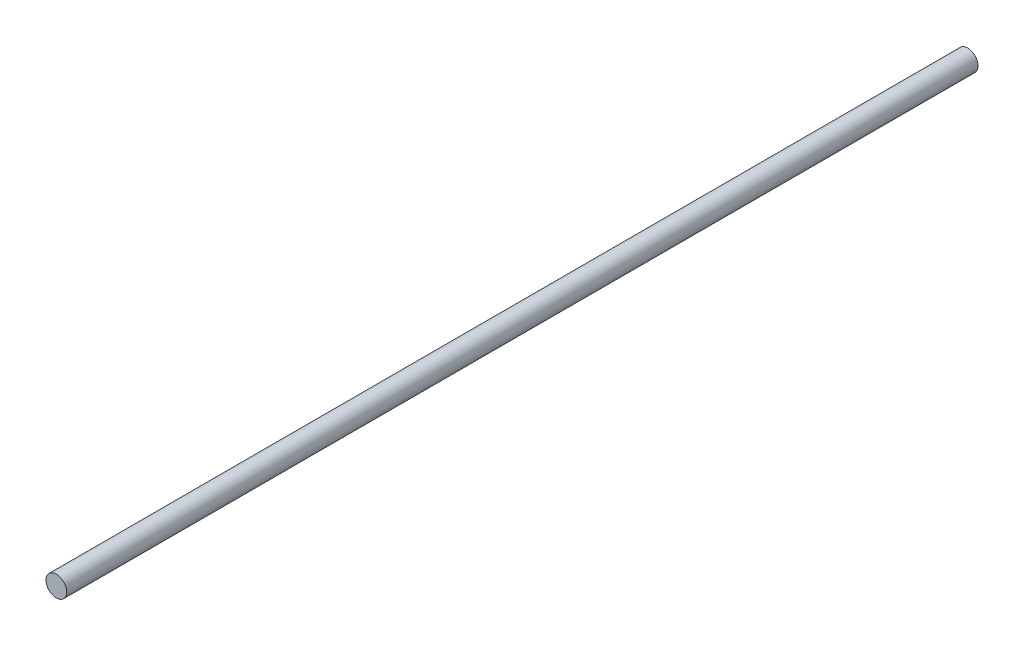
ISO-10303-21;
HEADER;
FILE_DESCRIPTION(('STEP AP214'),'2;1');
FILE_NAME('part.step','',(''),(''),'','','');
FILE_SCHEMA(('AUTOMOTIVE_DESIGN { 1 0 10303 214 1 1 1 1 }'));
ENDSEC;
DATA;
#1=APPLICATION_CONTEXT('core data for automotive mechanical design processes');
#2=APPLICATION_PROTOCOL_DEFINITION('international standard','automotive_design',2000,#1);
#3=PRODUCT_CONTEXT('',#1,'mechanical');
#4=PRODUCT('Part','Part','',(#3));
#5=PRODUCT_RELATED_PRODUCT_CATEGORY('part','',(#4));
#6=PRODUCT_DEFINITION_FORMATION('','',#4);
#7=PRODUCT_DEFINITION_CONTEXT('part definition',#1,'design');
#8=PRODUCT_DEFINITION('design','',#6,#7);
#9=PRODUCT_DEFINITION_SHAPE('','',#8);
#10=(LENGTH_UNIT() NAMED_UNIT(*) SI_UNIT(.MILLI.,.METRE.));
#11=(NAMED_UNIT(*) PLANE_ANGLE_UNIT() SI_UNIT($,.RADIAN.));
#12=(NAMED_UNIT(*) SI_UNIT($,.STERADIAN.) SOLID_ANGLE_UNIT());
#13=UNCERTAINTY_MEASURE_WITH_UNIT(LENGTH_MEASURE(1.E-05),#10,'distance_accuracy_value','');
#14=(GEOMETRIC_REPRESENTATION_CONTEXT(3) GLOBAL_UNCERTAINTY_ASSIGNED_CONTEXT((#13)) GLOBAL_UNIT_ASSIGNED_CONTEXT((#10,
#11,#12)) REPRESENTATION_CONTEXT('',''));
#15=CARTESIAN_POINT('',(0.,0.,0.));
#16=DIRECTION('',(0.,0.,1.));
#17=DIRECTION('',(1.,0.,0.));
#18=AXIS2_PLACEMENT_3D('',#15,#16,#17);
#19=CARTESIAN_POINT('',(0.,0.,280.035));
#20=DIRECTION('',(0.,0.,-1.));
#21=DIRECTION('',(-1.,0.,0.));
#22=AXIS2_PLACEMENT_3D('',#19,#20,#21);
#23=CYLINDRICAL_SURFACE('',#22,3.175);
#24=CARTESIAN_POINT('',(0.,0.,280.035));
#25=DIRECTION('',(0.,0.,1.));
#26=DIRECTION('',(1.,0.,0.));
#27=AXIS2_PLACEMENT_3D('',#24,#25,#26);
#28=CIRCLE('',#27,3.175);
#29=CARTESIAN_POINT('',(3.175,0.,280.035));
#30=VERTEX_POINT('',#29);
#31=EDGE_CURVE('E10',#30,#30,#28,.T.);
#32=ORIENTED_EDGE('',*,*,#31,.F.);
#33=EDGE_LOOP('',(#32));
#34=FACE_BOUND('',#33,.T.);
#35=CARTESIAN_POINT('',(0.,0.,0.));
#36=DIRECTION('',(0.,0.,1.));
#37=DIRECTION('',(1.,0.,0.));
#38=AXIS2_PLACEMENT_3D('',#35,#36,#37);
#39=CIRCLE('',#38,3.175);
#40=CARTESIAN_POINT('',(3.175,0.,0.));
#41=VERTEX_POINT('',#40);
#42=EDGE_CURVE('E42',#41,#41,#39,.T.);
#43=ORIENTED_EDGE('',*,*,#42,.T.);
#44=EDGE_LOOP('',(#43));
#45=FACE_BOUND('',#44,.T.);
#46=ADVANCED_FACE('F41',(#34,#45),#23,.T.);
#47=CARTESIAN_POINT('',(0.,0.,280.035));
#48=DIRECTION('',(0.,0.,1.));
#49=DIRECTION('',(1.,0.,0.));
#50=AXIS2_PLACEMENT_3D('',#47,#48,#49);
#51=PLANE('',#50);
#52=ORIENTED_EDGE('',*,*,#31,.T.);
#53=EDGE_LOOP('',(#52));
#54=FACE_BOUND('',#53,.T.);
#55=ADVANCED_FACE('F57',(#54),#51,.T.);
#56=CARTESIAN_POINT('',(0.,0.,0.));
#57=DIRECTION('',(0.,0.,1.));
#58=DIRECTION('',(1.,0.,0.));
#59=AXIS2_PLACEMENT_3D('',#56,#57,#58);
#60=PLANE('',#59);
#61=ORIENTED_EDGE('',*,*,#42,.F.);
#62=EDGE_LOOP('',(#61));
#63=FACE_BOUND('',#62,.T.);
#64=ADVANCED_FACE('F53',(#63),#60,.F.);
#65=CLOSED_SHELL('',(#46,#55,#64));
#66=MANIFOLD_SOLID_BREP('B2',#65);
#67=ADVANCED_BREP_SHAPE_REPRESENTATION('',(#18,#66),#14);
#68=SHAPE_DEFINITION_REPRESENTATION(#9,#67);
ENDSEC;
END-ISO-10303-21;
